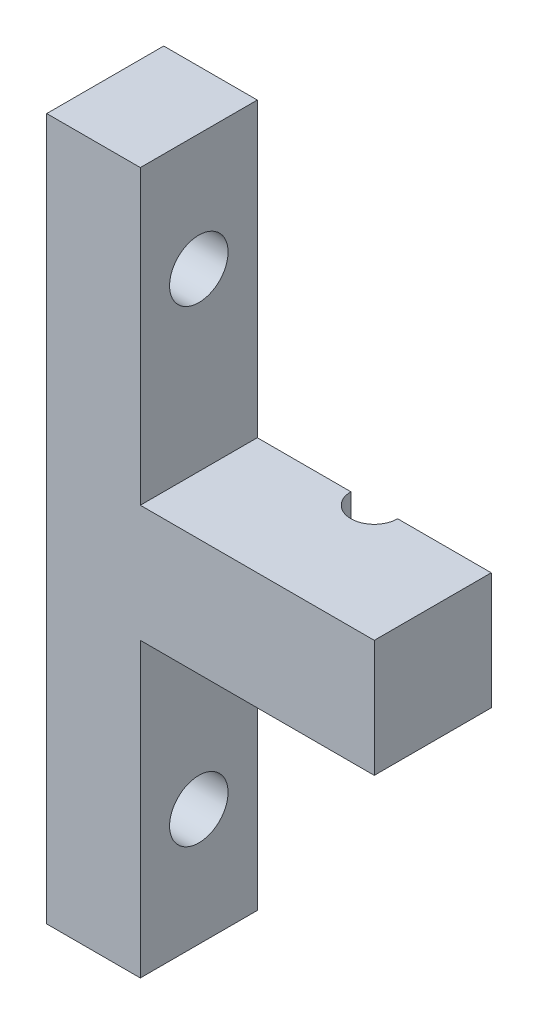
ISO-10303-21;
HEADER;
FILE_DESCRIPTION(('STEP AP214'),'2;1');
FILE_NAME('part.step','',(''),(''),'','','');
FILE_SCHEMA(('AUTOMOTIVE_DESIGN { 1 0 10303 214 1 1 1 1 }'));
ENDSEC;
DATA;
#1=APPLICATION_CONTEXT('core data for automotive mechanical design processes');
#2=APPLICATION_PROTOCOL_DEFINITION('international standard','automotive_design',2000,#1);
#3=PRODUCT_CONTEXT('',#1,'mechanical');
#4=PRODUCT('Part','Part','',(#3));
#5=PRODUCT_RELATED_PRODUCT_CATEGORY('part','',(#4));
#6=PRODUCT_DEFINITION_FORMATION('','',#4);
#7=PRODUCT_DEFINITION_CONTEXT('part definition',#1,'design');
#8=PRODUCT_DEFINITION('design','',#6,#7);
#9=PRODUCT_DEFINITION_SHAPE('','',#8);
#10=(LENGTH_UNIT() NAMED_UNIT(*) SI_UNIT(.MILLI.,.METRE.));
#11=(NAMED_UNIT(*) PLANE_ANGLE_UNIT() SI_UNIT($,.RADIAN.));
#12=(NAMED_UNIT(*) SI_UNIT($,.STERADIAN.) SOLID_ANGLE_UNIT());
#13=UNCERTAINTY_MEASURE_WITH_UNIT(LENGTH_MEASURE(1.E-05),#10,'distance_accuracy_value','');
#14=(GEOMETRIC_REPRESENTATION_CONTEXT(3) GLOBAL_UNCERTAINTY_ASSIGNED_CONTEXT((#13)) GLOBAL_UNIT_ASSIGNED_CONTEXT((#10,
#11,#12)) REPRESENTATION_CONTEXT('',''));
#15=CARTESIAN_POINT('',(0.,0.,0.));
#16=DIRECTION('',(0.,0.,1.));
#17=DIRECTION('',(1.,0.,0.));
#18=AXIS2_PLACEMENT_3D('',#15,#16,#17);
#19=CARTESIAN_POINT('',(0.,30.,0.));
#20=DIRECTION('',(0.,0.,1.));
#21=DIRECTION('',(1.,0.,0.));
#22=AXIS2_PLACEMENT_3D('',#19,#20,#21);
#23=PLANE('',#22);
#24=DIRECTION('',(0.,-1.,0.));
#25=VECTOR('',#24,1.);
#26=CARTESIAN_POINT('',(8.,30.,0.));
#27=LINE('',#26,#25);
#28=CARTESIAN_POINT('',(8.,17.5,0.));
#29=VERTEX_POINT('',#28);
#30=CARTESIAN_POINT('',(8.,12.5,0.));
#31=VERTEX_POINT('',#30);
#32=EDGE_CURVE('E55',#29,#31,#27,.T.);
#33=ORIENTED_EDGE('',*,*,#32,.T.);
#34=DIRECTION('',(-1.,0.,0.));
#35=VECTOR('',#34,1.);
#36=CARTESIAN_POINT('',(14.,12.5,0.));
#37=LINE('',#36,#35);
#38=CARTESIAN_POINT('',(4.,12.5,0.));
#39=VERTEX_POINT('',#38);
#40=EDGE_CURVE('E128',#31,#39,#37,.T.);
#41=ORIENTED_EDGE('',*,*,#40,.T.);
#42=DIRECTION('',(0.,-1.,0.));
#43=VECTOR('',#42,1.);
#44=CARTESIAN_POINT('',(4.,30.,0.));
#45=LINE('',#44,#43);
#46=CARTESIAN_POINT('',(4.,0.,0.));
#47=VERTEX_POINT('',#46);
#48=EDGE_CURVE('E166',#39,#47,#45,.T.);
#49=ORIENTED_EDGE('',*,*,#48,.T.);
#50=DIRECTION('',(-1.,0.,0.));
#51=VECTOR('',#50,1.);
#52=CARTESIAN_POINT('',(0.,0.,0.));
#53=LINE('',#52,#51);
#54=CARTESIAN_POINT('',(0.,0.,0.));
#55=VERTEX_POINT('',#54);
#56=EDGE_CURVE('E148',#47,#55,#53,.T.);
#57=ORIENTED_EDGE('',*,*,#56,.T.);
#58=DIRECTION('',(0.,-1.,0.));
#59=VECTOR('',#58,1.);
#60=CARTESIAN_POINT('',(0.,30.,0.));
#61=LINE('',#60,#59);
#62=CARTESIAN_POINT('',(0.,30.,0.));
#63=VERTEX_POINT('',#62);
#64=EDGE_CURVE('E154',#63,#55,#61,.T.);
#65=ORIENTED_EDGE('',*,*,#64,.F.);
#66=DIRECTION('',(-1.,0.,0.));
#67=VECTOR('',#66,1.);
#68=CARTESIAN_POINT('',(0.,30.,0.));
#69=LINE('',#68,#67);
#70=CARTESIAN_POINT('',(4.,30.,0.));
#71=VERTEX_POINT('',#70);
#72=EDGE_CURVE('E152',#71,#63,#69,.T.);
#73=ORIENTED_EDGE('',*,*,#72,.F.);
#74=CARTESIAN_POINT('',(4.,17.5,0.));
#75=VERTEX_POINT('',#74);
#76=EDGE_CURVE('E167',#71,#75,#45,.T.);
#77=ORIENTED_EDGE('',*,*,#76,.T.);
#78=DIRECTION('',(-1.,0.,0.));
#79=VECTOR('',#78,1.);
#80=CARTESIAN_POINT('',(14.,17.5,0.));
#81=LINE('',#80,#79);
#82=EDGE_CURVE('E130',#29,#75,#81,.T.);
#83=ORIENTED_EDGE('',*,*,#82,.F.);
#84=EDGE_LOOP('',(#33,#41,#49,#57,#65,#73,#77,#83));
#85=FACE_BOUND('',#84,.T.);
#86=ADVANCED_FACE('F41',(#85),#23,.F.);
#87=DIRECTION('',(0.,-1.,0.));
#88=VECTOR('',#87,1.);
#89=CARTESIAN_POINT('',(10.,30.,0.));
#90=LINE('',#89,#88);
#91=CARTESIAN_POINT('',(10.,17.5,0.));
#92=VERTEX_POINT('',#91);
#93=CARTESIAN_POINT('',(10.,12.5,0.));
#94=VERTEX_POINT('',#93);
#95=EDGE_CURVE('E119',#92,#94,#90,.T.);
#96=ORIENTED_EDGE('',*,*,#95,.F.);
#97=CARTESIAN_POINT('',(14.,17.5,0.));
#98=VERTEX_POINT('',#97);
#99=EDGE_CURVE('E135',#98,#92,#81,.T.);
#100=ORIENTED_EDGE('',*,*,#99,.F.);
#101=DIRECTION('',(0.,1.,0.));
#102=VECTOR('',#101,1.);
#103=CARTESIAN_POINT('',(14.,17.5,0.));
#104=LINE('',#103,#102);
#105=CARTESIAN_POINT('',(14.,12.5,0.));
#106=VERTEX_POINT('',#105);
#107=EDGE_CURVE('E191',#106,#98,#104,.T.);
#108=ORIENTED_EDGE('',*,*,#107,.F.);
#109=EDGE_CURVE('E134',#106,#94,#37,.T.);
#110=ORIENTED_EDGE('',*,*,#109,.T.);
#111=EDGE_LOOP('',(#96,#100,#108,#110));
#112=FACE_BOUND('',#111,.T.);
#113=ADVANCED_FACE('F229',(#112),#23,.F.);
#114=CARTESIAN_POINT('',(14.,12.5,5.));
#115=DIRECTION('',(0.,1.,0.));
#116=DIRECTION('',(0.,0.,1.));
#117=AXIS2_PLACEMENT_3D('',#114,#115,#116);
#118=PLANE('',#117);
#119=CARTESIAN_POINT('',(9.,12.5,0.));
#120=DIRECTION('',(0.,1.,0.));
#121=DIRECTION('',(0.,0.,1.));
#122=AXIS2_PLACEMENT_3D('',#119,#120,#121);
#123=CIRCLE('',#122,1.);
#124=EDGE_CURVE('E116',#94,#31,#123,.F.);
#125=ORIENTED_EDGE('',*,*,#124,.F.);
#126=ORIENTED_EDGE('',*,*,#109,.F.);
#127=DIRECTION('',(0.,0.,-1.));
#128=VECTOR('',#127,1.);
#129=CARTESIAN_POINT('',(14.,12.5,5.));
#130=LINE('',#129,#128);
#131=CARTESIAN_POINT('',(14.,12.5,5.));
#132=VERTEX_POINT('',#131);
#133=EDGE_CURVE('E187',#132,#106,#130,.T.);
#134=ORIENTED_EDGE('',*,*,#133,.F.);
#135=DIRECTION('',(-1.,0.,0.));
#136=VECTOR('',#135,1.);
#137=CARTESIAN_POINT('',(14.,12.5,5.));
#138=LINE('',#137,#136);
#139=CARTESIAN_POINT('',(4.,12.5,5.));
#140=VERTEX_POINT('',#139);
#141=EDGE_CURVE('E137',#132,#140,#138,.T.);
#142=ORIENTED_EDGE('',*,*,#141,.T.);
#143=DIRECTION('',(0.,0.,-1.));
#144=VECTOR('',#143,1.);
#145=CARTESIAN_POINT('',(4.,12.5,5.));
#146=LINE('',#145,#144);
#147=EDGE_CURVE('E63',#140,#39,#146,.T.);
#148=ORIENTED_EDGE('',*,*,#147,.T.);
#149=ORIENTED_EDGE('',*,*,#40,.F.);
#150=EDGE_LOOP('',(#125,#126,#134,#142,#148,#149));
#151=FACE_BOUND('',#150,.T.);
#152=ADVANCED_FACE('F132',(#151),#118,.F.);
#153=CARTESIAN_POINT('',(14.,17.5,5.));
#154=DIRECTION('',(0.,-1.,0.));
#155=DIRECTION('',(0.,0.,-1.));
#156=AXIS2_PLACEMENT_3D('',#153,#154,#155);
#157=PLANE('',#156);
#158=CARTESIAN_POINT('',(9.,17.5,0.));
#159=DIRECTION('',(0.,-1.,0.));
#160=DIRECTION('',(0.,0.,-1.));
#161=AXIS2_PLACEMENT_3D('',#158,#159,#160);
#162=CIRCLE('',#161,1.);
#163=EDGE_CURVE('E11',#29,#92,#162,.F.);
#164=ORIENTED_EDGE('',*,*,#163,.F.);
#165=ORIENTED_EDGE('',*,*,#82,.T.);
#166=DIRECTION('',(0.,0.,1.));
#167=VECTOR('',#166,1.);
#168=CARTESIAN_POINT('',(4.,17.5,5.));
#169=LINE('',#168,#167);
#170=CARTESIAN_POINT('',(4.,17.5,5.));
#171=VERTEX_POINT('',#170);
#172=EDGE_CURVE('E199',#75,#171,#169,.T.);
#173=ORIENTED_EDGE('',*,*,#172,.T.);
#174=DIRECTION('',(-1.,0.,0.));
#175=VECTOR('',#174,1.);
#176=CARTESIAN_POINT('',(14.,17.5,5.));
#177=LINE('',#176,#175);
#178=CARTESIAN_POINT('',(14.,17.5,5.));
#179=VERTEX_POINT('',#178);
#180=EDGE_CURVE('E208',#179,#171,#177,.T.);
#181=ORIENTED_EDGE('',*,*,#180,.F.);
#182=DIRECTION('',(0.,0.,1.));
#183=VECTOR('',#182,1.);
#184=CARTESIAN_POINT('',(14.,17.5,5.));
#185=LINE('',#184,#183);
#186=EDGE_CURVE('E196',#98,#179,#185,.T.);
#187=ORIENTED_EDGE('',*,*,#186,.F.);
#188=ORIENTED_EDGE('',*,*,#99,.T.);
#189=EDGE_LOOP('',(#164,#165,#173,#181,#187,#188));
#190=FACE_BOUND('',#189,.T.);
#191=ADVANCED_FACE('F212',(#190),#157,.F.);
#192=CARTESIAN_POINT('',(4.,30.,0.));
#193=DIRECTION('',(-1.,0.,0.));
#194=DIRECTION('',(0.,0.,1.));
#195=AXIS2_PLACEMENT_3D('',#192,#193,#194);
#196=PLANE('',#195);
#197=CARTESIAN_POINT('',(4.,25.,2.5));
#198=DIRECTION('',(1.,0.,0.));
#199=DIRECTION('',(0.,0.,-1.));
#200=AXIS2_PLACEMENT_3D('',#197,#198,#199);
#201=CIRCLE('',#200,1.25);
#202=CARTESIAN_POINT('',(4.,25.,1.25));
#203=VERTEX_POINT('',#202);
#204=EDGE_CURVE('E247',#203,#203,#201,.T.);
#205=ORIENTED_EDGE('',*,*,#204,.F.);
#206=EDGE_LOOP('',(#205));
#207=FACE_BOUND('',#206,.T.);
#208=ORIENTED_EDGE('',*,*,#172,.F.);
#209=ORIENTED_EDGE('',*,*,#76,.F.);
#210=DIRECTION('',(0.,0.,-1.));
#211=VECTOR('',#210,1.);
#212=CARTESIAN_POINT('',(4.,30.,0.));
#213=LINE('',#212,#211);
#214=CARTESIAN_POINT('',(4.,30.,5.));
#215=VERTEX_POINT('',#214);
#216=EDGE_CURVE('E150',#215,#71,#213,.T.);
#217=ORIENTED_EDGE('',*,*,#216,.F.);
#218=DIRECTION('',(0.,-1.,0.));
#219=VECTOR('',#218,1.);
#220=CARTESIAN_POINT('',(4.,30.,5.));
#221=LINE('',#220,#219);
#222=EDGE_CURVE('E170',#215,#171,#221,.T.);
#223=ORIENTED_EDGE('',*,*,#222,.T.);
#224=EDGE_LOOP('',(#208,#209,#217,#223));
#225=FACE_BOUND('',#224,.T.);
#226=ADVANCED_FACE('F215',(#207,#225),#196,.F.);
#227=CARTESIAN_POINT('',(4.,5.,2.5));
#228=DIRECTION('',(1.,0.,0.));
#229=DIRECTION('',(0.,0.,1.));
#230=AXIS2_PLACEMENT_3D('',#227,#228,#229);
#231=CIRCLE('',#230,1.25);
#232=CARTESIAN_POINT('',(4.,5.,3.75));
#233=VERTEX_POINT('',#232);
#234=EDGE_CURVE('E249',#233,#233,#231,.T.);
#235=ORIENTED_EDGE('',*,*,#234,.F.);
#236=EDGE_LOOP('',(#235));
#237=FACE_BOUND('',#236,.T.);
#238=ORIENTED_EDGE('',*,*,#147,.F.);
#239=CARTESIAN_POINT('',(4.,0.,5.));
#240=VERTEX_POINT('',#239);
#241=EDGE_CURVE('E169',#140,#240,#221,.T.);
#242=ORIENTED_EDGE('',*,*,#241,.T.);
#243=DIRECTION('',(0.,0.,-1.));
#244=VECTOR('',#243,1.);
#245=CARTESIAN_POINT('',(4.,0.,0.));
#246=LINE('',#245,#244);
#247=EDGE_CURVE('E160',#240,#47,#246,.T.);
#248=ORIENTED_EDGE('',*,*,#247,.T.);
#249=ORIENTED_EDGE('',*,*,#48,.F.);
#250=EDGE_LOOP('',(#238,#242,#248,#249));
#251=FACE_BOUND('',#250,.T.);
#252=ADVANCED_FACE('F184',(#237,#251),#196,.F.);
#253=CARTESIAN_POINT('',(0.,30.,0.));
#254=DIRECTION('',(1.,0.,0.));
#255=DIRECTION('',(0.,0.,-1.));
#256=AXIS2_PLACEMENT_3D('',#253,#254,#255);
#257=PLANE('',#256);
#258=CARTESIAN_POINT('',(0.,25.,2.5));
#259=DIRECTION('',(1.,0.,0.));
#260=DIRECTION('',(0.,0.,-1.));
#261=AXIS2_PLACEMENT_3D('',#258,#259,#260);
#262=CIRCLE('',#261,1.25);
#263=CARTESIAN_POINT('',(0.,25.,1.25));
#264=VERTEX_POINT('',#263);
#265=EDGE_CURVE('E209',#264,#264,#262,.T.);
#266=ORIENTED_EDGE('',*,*,#265,.T.);
#267=EDGE_LOOP('',(#266));
#268=FACE_BOUND('',#267,.T.);
#269=CARTESIAN_POINT('',(0.,5.,2.5));
#270=DIRECTION('',(1.,0.,0.));
#271=DIRECTION('',(0.,0.,1.));
#272=AXIS2_PLACEMENT_3D('',#269,#270,#271);
#273=CIRCLE('',#272,1.25);
#274=CARTESIAN_POINT('',(0.,5.,3.75));
#275=VERTEX_POINT('',#274);
#276=EDGE_CURVE('E124',#275,#275,#273,.T.);
#277=ORIENTED_EDGE('',*,*,#276,.T.);
#278=EDGE_LOOP('',(#277));
#279=FACE_BOUND('',#278,.T.);
#280=DIRECTION('',(0.,0.,1.));
#281=VECTOR('',#280,1.);
#282=CARTESIAN_POINT('',(0.,0.,0.));
#283=LINE('',#282,#281);
#284=CARTESIAN_POINT('',(0.,0.,5.));
#285=VERTEX_POINT('',#284);
#286=EDGE_CURVE('E143',#55,#285,#283,.T.);
#287=ORIENTED_EDGE('',*,*,#286,.T.);
#288=DIRECTION('',(0.,-1.,0.));
#289=VECTOR('',#288,1.);
#290=CARTESIAN_POINT('',(0.,30.,5.));
#291=LINE('',#290,#289);
#292=CARTESIAN_POINT('',(0.,30.,5.));
#293=VERTEX_POINT('',#292);
#294=EDGE_CURVE('E49',#293,#285,#291,.T.);
#295=ORIENTED_EDGE('',*,*,#294,.F.);
#296=DIRECTION('',(0.,0.,1.));
#297=VECTOR('',#296,1.);
#298=CARTESIAN_POINT('',(0.,30.,0.));
#299=LINE('',#298,#297);
#300=EDGE_CURVE('E144',#63,#293,#299,.T.);
#301=ORIENTED_EDGE('',*,*,#300,.F.);
#302=ORIENTED_EDGE('',*,*,#64,.T.);
#303=EDGE_LOOP('',(#287,#295,#301,#302));
#304=FACE_BOUND('',#303,.T.);
#305=ADVANCED_FACE('F43',(#268,#279,#304),#257,.F.);
#306=CARTESIAN_POINT('',(0.,30.,5.));
#307=DIRECTION('',(0.,0.,-1.));
#308=DIRECTION('',(-1.,0.,0.));
#309=AXIS2_PLACEMENT_3D('',#306,#307,#308);
#310=PLANE('',#309);
#311=DIRECTION('',(1.,0.,0.));
#312=VECTOR('',#311,1.);
#313=CARTESIAN_POINT('',(0.,0.,5.));
#314=LINE('',#313,#312);
#315=EDGE_CURVE('E157',#285,#240,#314,.T.);
#316=ORIENTED_EDGE('',*,*,#315,.T.);
#317=ORIENTED_EDGE('',*,*,#241,.F.);
#318=ORIENTED_EDGE('',*,*,#141,.F.);
#319=DIRECTION('',(0.,-1.,0.));
#320=VECTOR('',#319,1.);
#321=CARTESIAN_POINT('',(14.,17.5,5.));
#322=LINE('',#321,#320);
#323=EDGE_CURVE('E192',#179,#132,#322,.T.);
#324=ORIENTED_EDGE('',*,*,#323,.F.);
#325=ORIENTED_EDGE('',*,*,#180,.T.);
#326=ORIENTED_EDGE('',*,*,#222,.F.);
#327=DIRECTION('',(1.,0.,0.));
#328=VECTOR('',#327,1.);
#329=CARTESIAN_POINT('',(0.,30.,5.));
#330=LINE('',#329,#328);
#331=EDGE_CURVE('E147',#293,#215,#330,.T.);
#332=ORIENTED_EDGE('',*,*,#331,.F.);
#333=ORIENTED_EDGE('',*,*,#294,.T.);
#334=EDGE_LOOP('',(#316,#317,#318,#324,#325,#326,#332,#333));
#335=FACE_BOUND('',#334,.T.);
#336=ADVANCED_FACE('F174',(#335),#310,.F.);
#337=CARTESIAN_POINT('',(0.,30.,0.));
#338=DIRECTION('',(0.,1.,0.));
#339=DIRECTION('',(0.,0.,1.));
#340=AXIS2_PLACEMENT_3D('',#337,#338,#339);
#341=PLANE('',#340);
#342=ORIENTED_EDGE('',*,*,#300,.T.);
#343=ORIENTED_EDGE('',*,*,#331,.T.);
#344=ORIENTED_EDGE('',*,*,#216,.T.);
#345=ORIENTED_EDGE('',*,*,#72,.T.);
#346=EDGE_LOOP('',(#342,#343,#344,#345));
#347=FACE_BOUND('',#346,.T.);
#348=ADVANCED_FACE('F219',(#347),#341,.T.);
#349=CARTESIAN_POINT('',(0.,0.,0.));
#350=DIRECTION('',(0.,1.,0.));
#351=DIRECTION('',(0.,0.,1.));
#352=AXIS2_PLACEMENT_3D('',#349,#350,#351);
#353=PLANE('',#352);
#354=ORIENTED_EDGE('',*,*,#286,.F.);
#355=ORIENTED_EDGE('',*,*,#56,.F.);
#356=ORIENTED_EDGE('',*,*,#247,.F.);
#357=ORIENTED_EDGE('',*,*,#315,.F.);
#358=EDGE_LOOP('',(#354,#355,#356,#357));
#359=FACE_BOUND('',#358,.T.);
#360=ADVANCED_FACE('F183',(#359),#353,.F.);
#361=CARTESIAN_POINT('',(14.,0.,0.));
#362=DIRECTION('',(1.,0.,0.));
#363=DIRECTION('',(0.,0.,-1.));
#364=AXIS2_PLACEMENT_3D('',#361,#362,#363);
#365=PLANE('',#364);
#366=ORIENTED_EDGE('',*,*,#323,.T.);
#367=ORIENTED_EDGE('',*,*,#133,.T.);
#368=ORIENTED_EDGE('',*,*,#107,.T.);
#369=ORIENTED_EDGE('',*,*,#186,.T.);
#370=EDGE_LOOP('',(#366,#367,#368,#369));
#371=FACE_BOUND('',#370,.T.);
#372=ADVANCED_FACE('F194',(#371),#365,.T.);
#373=CARTESIAN_POINT('',(0.,5.,2.5));
#374=DIRECTION('',(1.,0.,0.));
#375=DIRECTION('',(0.,0.,-1.));
#376=AXIS2_PLACEMENT_3D('',#373,#374,#375);
#377=CYLINDRICAL_SURFACE('',#376,1.25);
#378=ORIENTED_EDGE('',*,*,#276,.F.);
#379=EDGE_LOOP('',(#378));
#380=FACE_BOUND('',#379,.T.);
#381=ORIENTED_EDGE('',*,*,#234,.T.);
#382=EDGE_LOOP('',(#381));
#383=FACE_BOUND('',#382,.T.);
#384=ADVANCED_FACE('F261',(#380,#383),#377,.F.);
#385=CARTESIAN_POINT('',(0.,25.,2.5));
#386=DIRECTION('',(1.,0.,0.));
#387=DIRECTION('',(0.,0.,-1.));
#388=AXIS2_PLACEMENT_3D('',#385,#386,#387);
#389=CYLINDRICAL_SURFACE('',#388,1.25);
#390=ORIENTED_EDGE('',*,*,#265,.F.);
#391=EDGE_LOOP('',(#390));
#392=FACE_BOUND('',#391,.T.);
#393=ORIENTED_EDGE('',*,*,#204,.T.);
#394=EDGE_LOOP('',(#393));
#395=FACE_BOUND('',#394,.T.);
#396=ADVANCED_FACE('F263',(#392,#395),#389,.F.);
#397=CARTESIAN_POINT('',(9.,30.,0.));
#398=DIRECTION('',(0.,-1.,0.));
#399=DIRECTION('',(0.,0.,-1.));
#400=AXIS2_PLACEMENT_3D('',#397,#398,#399);
#401=CYLINDRICAL_SURFACE('',#400,1.);
#402=ORIENTED_EDGE('',*,*,#124,.T.);
#403=ORIENTED_EDGE('',*,*,#32,.F.);
#404=ORIENTED_EDGE('',*,*,#163,.T.);
#405=ORIENTED_EDGE('',*,*,#95,.T.);
#406=EDGE_LOOP('',(#402,#403,#404,#405));
#407=FACE_BOUND('',#406,.T.);
#408=ADVANCED_FACE('F117',(#407),#401,.F.);
#409=CLOSED_SHELL('',(#86,#113,#152,#191,#226,#252,#305,#336,#348,#360,#372,#384,#396,#408));
#410=MANIFOLD_SOLID_BREP('B2',#409);
#411=ADVANCED_BREP_SHAPE_REPRESENTATION('',(#18,#410),#14);
#412=SHAPE_DEFINITION_REPRESENTATION(#9,#411);
ENDSEC;
END-ISO-10303-21;
